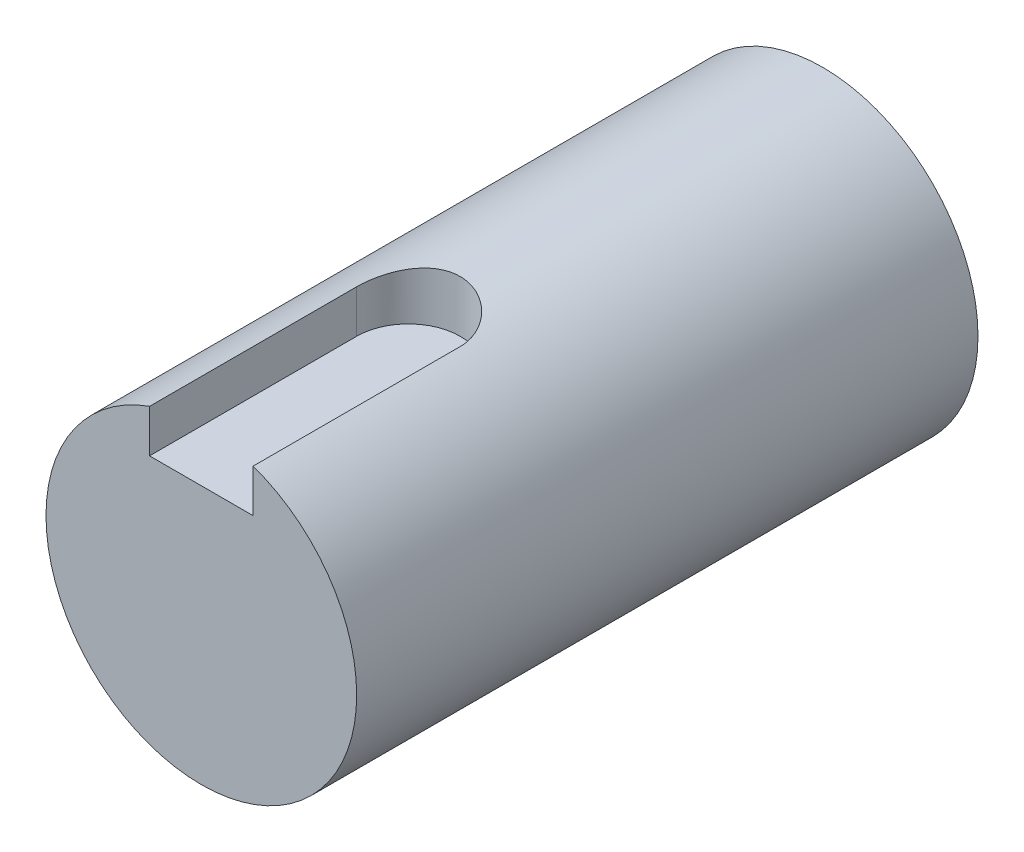
ISO-10303-21;
HEADER;
FILE_DESCRIPTION(('STEP AP214'),'2;1');
FILE_NAME('part.step','',(''),(''),'','','');
FILE_SCHEMA(('AUTOMOTIVE_DESIGN { 1 0 10303 214 1 1 1 1 }'));
ENDSEC;
DATA;
#1=APPLICATION_CONTEXT('core data for automotive mechanical design processes');
#2=APPLICATION_PROTOCOL_DEFINITION('international standard','automotive_design',2000,#1);
#3=PRODUCT_CONTEXT('',#1,'mechanical');
#4=PRODUCT('Part','Part','',(#3));
#5=PRODUCT_RELATED_PRODUCT_CATEGORY('part','',(#4));
#6=PRODUCT_DEFINITION_FORMATION('','',#4);
#7=PRODUCT_DEFINITION_CONTEXT('part definition',#1,'design');
#8=PRODUCT_DEFINITION('design','',#6,#7);
#9=PRODUCT_DEFINITION_SHAPE('','',#8);
#10=(LENGTH_UNIT() NAMED_UNIT(*) SI_UNIT(.MILLI.,.METRE.));
#11=(NAMED_UNIT(*) PLANE_ANGLE_UNIT() SI_UNIT($,.RADIAN.));
#12=(NAMED_UNIT(*) SI_UNIT($,.STERADIAN.) SOLID_ANGLE_UNIT());
#13=UNCERTAINTY_MEASURE_WITH_UNIT(LENGTH_MEASURE(1.E-05),#10,'distance_accuracy_value','');
#14=(GEOMETRIC_REPRESENTATION_CONTEXT(3) GLOBAL_UNCERTAINTY_ASSIGNED_CONTEXT((#13)) GLOBAL_UNIT_ASSIGNED_CONTEXT((#10,
#11,#12)) REPRESENTATION_CONTEXT('',''));
#15=CARTESIAN_POINT('',(0.,0.,0.));
#16=DIRECTION('',(0.,0.,1.));
#17=DIRECTION('',(1.,0.,0.));
#18=AXIS2_PLACEMENT_3D('',#15,#16,#17);
#19=CARTESIAN_POINT('',(0.,0.,30.));
#20=DIRECTION('',(0.,0.,-1.));
#21=DIRECTION('',(-1.,0.,0.));
#22=AXIS2_PLACEMENT_3D('',#19,#20,#21);
#23=CYLINDRICAL_SURFACE('',#22,15.);
#24=CARTESIAN_POINT('',(0.,0.,30.));
#25=DIRECTION('',(0.,0.,1.));
#26=DIRECTION('',(1.,0.,0.));
#27=AXIS2_PLACEMENT_3D('',#24,#25,#26);
#28=CIRCLE('',#27,15.);
#29=CARTESIAN_POINT('',(-5.,14.142135623731,30.));
#30=VERTEX_POINT('',#29);
#31=CARTESIAN_POINT('',(5.,14.142135623731,30.));
#32=VERTEX_POINT('',#31);
#33=EDGE_CURVE('E88',#30,#32,#28,.T.);
#34=ORIENTED_EDGE('',*,*,#33,.F.);
#35=DIRECTION('',(0.,0.,-1.));
#36=VECTOR('',#35,1.);
#37=CARTESIAN_POINT('',(-5.,14.142135623731,30.));
#38=LINE('',#37,#36);
#39=CARTESIAN_POINT('',(-5.,14.142135623731,10.));
#40=VERTEX_POINT('',#39);
#41=EDGE_CURVE('E63',#30,#40,#38,.T.);
#42=ORIENTED_EDGE('',*,*,#41,.T.);
#43=CARTESIAN_POINT('',(-5.,14.142135623731,10.));
#44=CARTESIAN_POINT('',(-5.00001928272081,14.1421132795953,9.86358817209312));
#45=CARTESIAN_POINT('',(-4.99441839460028,14.144108585197,9.72718501435901));
#46=CARTESIAN_POINT('',(-4.97212026561631,14.1519707752355,9.45543675990578));
#47=CARTESIAN_POINT('',(-4.95542602013328,14.1578366145645,9.3200913875465));
#48=CARTESIAN_POINT('',(-4.91115048442878,14.1732535212275,9.05182134289903));
#49=CARTESIAN_POINT('',(-4.88360148534076,14.1827936562481,8.91889070309714));
#50=CARTESIAN_POINT('',(-4.81787909036062,14.2052544389481,8.65597535434243));
#51=CARTESIAN_POINT('',(-4.77970531049258,14.2181752088016,8.52599075204203));
#52=CARTESIAN_POINT('',(-4.69309505128876,14.2469974292543,8.26994100167007));
#53=CARTESIAN_POINT('',(-4.64466686529954,14.2628964699579,8.14387278010676));
#54=CARTESIAN_POINT('',(-4.53792631398361,14.2972152683245,7.8963314520598));
#55=CARTESIAN_POINT('',(-4.47961026060572,14.3156359660384,7.77486008089838));
#56=CARTESIAN_POINT('',(-4.29042487291366,14.3739242294785,7.41843107158721));
#57=CARTESIAN_POINT('',(-4.14528130436108,14.4168308914588,7.19134981636118));
#58=CARTESIAN_POINT('',(-3.81524041281298,14.5077282855086,6.75636212966205));
#59=CARTESIAN_POINT('',(-3.62912046165332,14.5558450324036,6.54941575101716));
#60=CARTESIAN_POINT('',(-3.22494665570402,14.6506912904573,6.16897975946276));
#61=CARTESIAN_POINT('',(-3.00688712664699,14.6974205533429,5.99549610413162));
#62=CARTESIAN_POINT('',(-2.53801699448498,14.7856944680589,5.68259966586795));
#63=CARTESIAN_POINT('',(-2.2865001167083,14.8270719634014,5.54419434373935));
#64=CARTESIAN_POINT('',(-1.76214657981255,14.8984803449503,5.31203947558852));
#65=CARTESIAN_POINT('',(-1.48931646315729,14.92851469674,5.21827628811271));
#66=CARTESIAN_POINT('',(-0.940146645163367,14.9729535792742,5.08132117918844));
#67=CARTESIAN_POINT('',(-0.66425915653923,14.9878654569488,5.03648357290232));
#68=CARTESIAN_POINT('',(-0.108494863035937,15.0021804126725,4.9934185716859));
#69=CARTESIAN_POINT('',(0.17138097539181,15.0015871861129,4.99518007061241));
#70=CARTESIAN_POINT('',(0.715519207983845,14.9853019394036,5.04422135119862));
#71=CARTESIAN_POINT('',(0.979963426374043,14.9702030725849,5.08971299687324));
#72=CARTESIAN_POINT('',(1.49722040864173,14.9273480020182,5.22196618630538));
#73=CARTESIAN_POINT('',(1.75003252671059,14.8995910964333,5.30873001844996));
#74=CARTESIAN_POINT('',(2.24076278220401,14.8337834991293,5.52210613127959));
#75=CARTESIAN_POINT('',(2.47844127676376,14.7956022127902,5.64922753790655));
#76=CARTESIAN_POINT('',(2.92962419733441,14.7129190630403,5.93930244539046));
#77=CARTESIAN_POINT('',(3.14312202351085,14.6684154814678,6.10226569333055));
#78=CARTESIAN_POINT('',(3.55048180391262,14.5753148518701,6.46834474013009));
#79=CARTESIAN_POINT('',(3.74294939170373,14.5266237190253,6.67298763784732));
#80=CARTESIAN_POINT('',(4.09137879648192,14.4323697370697,7.11224754170862));
#81=CARTESIAN_POINT('',(4.24732881968224,14.3868079019513,7.34687419375444));
#82=CARTESIAN_POINT('',(4.45137197181612,14.3244699574743,7.71839118796905));
#83=CARTESIAN_POINT('',(4.51477947987293,14.3045606178995,7.84656925595869));
#84=CARTESIAN_POINT('',(4.63050119526384,14.2675208843929,8.10820622619605));
#85=CARTESIAN_POINT('',(4.68282002045479,14.2503893343581,8.24166290259467));
#86=CARTESIAN_POINT('',(4.77584283639463,14.2194841629367,8.51277135820791));
#87=CARTESIAN_POINT('',(4.81655946314397,14.205706890793,8.65041839138003));
#88=CARTESIAN_POINT('',(4.88604801985988,14.1819560641116,8.92896019305926));
#89=CARTESIAN_POINT('',(4.91482540411389,14.1719807728584,9.0698534474523));
#90=CARTESIAN_POINT('',(4.9582745368723,14.156836654448,9.34205305818844));
#91=CARTESIAN_POINT('',(4.97391718926364,14.1513381564974,9.47318689947326));
#92=CARTESIAN_POINT('',(4.99478118687353,14.143980412972,9.7362104158748));
#93=CARTESIAN_POINT('',(5.00001597952916,14.1421164714419,9.86809889458486));
#94=CARTESIAN_POINT('',(5.,14.142135623731,10.));
#95=B_SPLINE_CURVE_WITH_KNOTS('',3,(#43,#44,#45,#46,#47,#48,#49,#50,#51,#52,#53,#54,#55,#56,#57,
#58,#59,#60,#61,#62,#63,#64,#65,#66,#67,#68,#69,#70,#71,#72,#73,#74,#75,#76,#77,#78,#79,#80,#81,
#82,#83,#84,#85,#86,#87,#88,#89,#90,#91,#92,#93,#94),.UNSPECIFIED.,.F.,.F.,(4,2,2,2,2,2,2,2,2,2,
2,2,2,2,2,2,2,2,2,2,2,2,2,2,2,4),(0.,0.409092423677163,0.818074430847307,1.22584885885815,
1.63363802561078,2.04109864022586,2.44871156823776,3.26359482908313,4.10724851154046,
4.95105225659394,5.81687991006164,6.68244281946294,7.51789679977672,8.35315166493869,
9.15564418669333,9.95818120881897,10.771274204705,11.584588592845,12.4361259663091,
13.2879379758687,13.7206337000479,14.1531488734623,14.5851911765746,15.0170358888757,
15.4131122811713,15.8086765909866),.UNSPECIFIED.);
#96=CARTESIAN_POINT('',(5.,14.142135623731,10.));
#97=VERTEX_POINT('',#96);
#98=EDGE_CURVE('E11',#40,#97,#95,.T.);
#99=ORIENTED_EDGE('',*,*,#98,.T.);
#100=DIRECTION('',(0.,0.,-1.));
#101=VECTOR('',#100,1.);
#102=CARTESIAN_POINT('',(5.,14.142135623731,30.));
#103=LINE('',#102,#101);
#104=EDGE_CURVE('E107',#97,#32,#103,.F.);
#105=ORIENTED_EDGE('',*,*,#104,.T.);
#106=EDGE_LOOP('',(#34,#42,#99,#105));
#107=FACE_BOUND('',#106,.T.);
#108=CARTESIAN_POINT('',(0.,0.,-30.));
#109=DIRECTION('',(0.,0.,1.));
#110=DIRECTION('',(1.,0.,0.));
#111=AXIS2_PLACEMENT_3D('',#108,#109,#110);
#112=CIRCLE('',#111,15.);
#113=CARTESIAN_POINT('',(15.,0.,-30.));
#114=VERTEX_POINT('',#113);
#115=EDGE_CURVE('E111',#114,#114,#112,.T.);
#116=ORIENTED_EDGE('',*,*,#115,.T.);
#117=EDGE_LOOP('',(#116));
#118=FACE_BOUND('',#117,.T.);
#119=ADVANCED_FACE('F36',(#107,#118),#23,.T.);
#120=CARTESIAN_POINT('',(0.,0.,30.));
#121=DIRECTION('',(0.,0.,1.));
#122=DIRECTION('',(1.,0.,0.));
#123=AXIS2_PLACEMENT_3D('',#120,#121,#122);
#124=PLANE('',#123);
#125=DIRECTION('',(0.,1.,0.));
#126=VECTOR('',#125,1.);
#127=CARTESIAN_POINT('',(-5.,10.,30.));
#128=LINE('',#127,#126);
#129=CARTESIAN_POINT('',(-5.,10.,30.));
#130=VERTEX_POINT('',#129);
#131=EDGE_CURVE('E109',#130,#30,#128,.T.);
#132=ORIENTED_EDGE('',*,*,#131,.T.);
#133=ORIENTED_EDGE('',*,*,#33,.T.);
#134=DIRECTION('',(0.,1.,0.));
#135=VECTOR('',#134,1.);
#136=CARTESIAN_POINT('',(5.,10.,30.));
#137=LINE('',#136,#135);
#138=CARTESIAN_POINT('',(5.,10.,30.));
#139=VERTEX_POINT('',#138);
#140=EDGE_CURVE('E91',#139,#32,#137,.T.);
#141=ORIENTED_EDGE('',*,*,#140,.F.);
#142=DIRECTION('',(-1.,0.,0.));
#143=VECTOR('',#142,1.);
#144=CARTESIAN_POINT('',(0.,10.,30.));
#145=LINE('',#144,#143);
#146=EDGE_CURVE('E49',#139,#130,#145,.T.);
#147=ORIENTED_EDGE('',*,*,#146,.T.);
#148=EDGE_LOOP('',(#132,#133,#141,#147));
#149=FACE_BOUND('',#148,.T.);
#150=ADVANCED_FACE('F99',(#149),#124,.T.);
#151=CARTESIAN_POINT('',(0.,0.,-30.));
#152=DIRECTION('',(0.,0.,1.));
#153=DIRECTION('',(1.,0.,0.));
#154=AXIS2_PLACEMENT_3D('',#151,#152,#153);
#155=PLANE('',#154);
#156=ORIENTED_EDGE('',*,*,#115,.F.);
#157=EDGE_LOOP('',(#156));
#158=FACE_BOUND('',#157,.T.);
#159=ADVANCED_FACE('F117',(#158),#155,.F.);
#160=CARTESIAN_POINT('',(0.,10.,10.));
#161=DIRECTION('',(0.,1.,0.));
#162=DIRECTION('',(0.,0.,1.));
#163=AXIS2_PLACEMENT_3D('',#160,#161,#162);
#164=CYLINDRICAL_SURFACE('',#163,5.);
#165=DIRECTION('',(0.,1.,0.));
#166=VECTOR('',#165,1.);
#167=CARTESIAN_POINT('',(-5.,10.,10.));
#168=LINE('',#167,#166);
#169=CARTESIAN_POINT('',(-5.,10.,10.));
#170=VERTEX_POINT('',#169);
#171=EDGE_CURVE('E102',#170,#40,#168,.T.);
#172=ORIENTED_EDGE('',*,*,#171,.F.);
#173=CARTESIAN_POINT('',(0.,10.,10.));
#174=DIRECTION('',(0.,1.,0.));
#175=DIRECTION('',(0.,0.,1.));
#176=AXIS2_PLACEMENT_3D('',#173,#174,#175);
#177=CIRCLE('',#176,5.);
#178=CARTESIAN_POINT('',(5.,10.,10.));
#179=VERTEX_POINT('',#178);
#180=EDGE_CURVE('E96',#179,#170,#177,.T.);
#181=ORIENTED_EDGE('',*,*,#180,.F.);
#182=DIRECTION('',(0.,1.,0.));
#183=VECTOR('',#182,1.);
#184=CARTESIAN_POINT('',(5.,10.,10.));
#185=LINE('',#184,#183);
#186=EDGE_CURVE('E94',#179,#97,#185,.T.);
#187=ORIENTED_EDGE('',*,*,#186,.T.);
#188=ORIENTED_EDGE('',*,*,#98,.F.);
#189=EDGE_LOOP('',(#172,#181,#187,#188));
#190=FACE_BOUND('',#189,.T.);
#191=ADVANCED_FACE('F119',(#190),#164,.F.);
#192=CARTESIAN_POINT('',(-5.,10.,30.));
#193=DIRECTION('',(-1.,0.,0.));
#194=DIRECTION('',(0.,0.,1.));
#195=AXIS2_PLACEMENT_3D('',#192,#193,#194);
#196=PLANE('',#195);
#197=ORIENTED_EDGE('',*,*,#131,.F.);
#198=DIRECTION('',(0.,0.,1.));
#199=VECTOR('',#198,1.);
#200=CARTESIAN_POINT('',(-5.,10.,30.));
#201=LINE('',#200,#199);
#202=EDGE_CURVE('E56',#170,#130,#201,.T.);
#203=ORIENTED_EDGE('',*,*,#202,.F.);
#204=ORIENTED_EDGE('',*,*,#171,.T.);
#205=ORIENTED_EDGE('',*,*,#41,.F.);
#206=EDGE_LOOP('',(#197,#203,#204,#205));
#207=FACE_BOUND('',#206,.T.);
#208=ADVANCED_FACE('F124',(#207),#196,.F.);
#209=CARTESIAN_POINT('',(5.,10.,30.));
#210=DIRECTION('',(1.,0.,0.));
#211=DIRECTION('',(0.,0.,-1.));
#212=AXIS2_PLACEMENT_3D('',#209,#210,#211);
#213=PLANE('',#212);
#214=ORIENTED_EDGE('',*,*,#186,.F.);
#215=DIRECTION('',(0.,0.,-1.));
#216=VECTOR('',#215,1.);
#217=CARTESIAN_POINT('',(5.,10.,30.));
#218=LINE('',#217,#216);
#219=EDGE_CURVE('E85',#139,#179,#218,.T.);
#220=ORIENTED_EDGE('',*,*,#219,.F.);
#221=ORIENTED_EDGE('',*,*,#140,.T.);
#222=ORIENTED_EDGE('',*,*,#104,.F.);
#223=EDGE_LOOP('',(#214,#220,#221,#222));
#224=FACE_BOUND('',#223,.T.);
#225=ADVANCED_FACE('F90',(#224),#213,.F.);
#226=CARTESIAN_POINT('',(0.,10.,30.));
#227=DIRECTION('',(0.,1.,0.));
#228=DIRECTION('',(0.,0.,1.));
#229=AXIS2_PLACEMENT_3D('',#226,#227,#228);
#230=PLANE('',#229);
#231=ORIENTED_EDGE('',*,*,#219,.T.);
#232=ORIENTED_EDGE('',*,*,#180,.T.);
#233=ORIENTED_EDGE('',*,*,#202,.T.);
#234=ORIENTED_EDGE('',*,*,#146,.F.);
#235=EDGE_LOOP('',(#231,#232,#233,#234));
#236=FACE_BOUND('',#235,.T.);
#237=ADVANCED_FACE('F84',(#236),#230,.T.);
#238=CLOSED_SHELL('',(#119,#150,#159,#191,#208,#225,#237));
#239=MANIFOLD_SOLID_BREP('B2',#238);
#240=ADVANCED_BREP_SHAPE_REPRESENTATION('',(#18,#239),#14);
#241=SHAPE_DEFINITION_REPRESENTATION(#9,#240);
ENDSEC;
END-ISO-10303-21;
